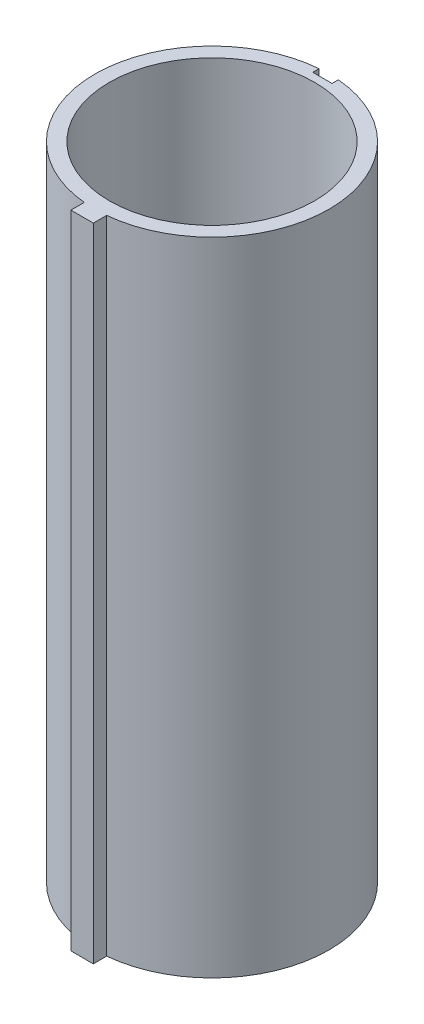
ISO-10303-21;
HEADER;
FILE_DESCRIPTION(('STEP AP214'),'2;1');
FILE_NAME('part.step','',(''),(''),'','','');
FILE_SCHEMA(('AUTOMOTIVE_DESIGN { 1 0 10303 214 1 1 1 1 }'));
ENDSEC;
DATA;
#1=APPLICATION_CONTEXT('core data for automotive mechanical design processes');
#2=APPLICATION_PROTOCOL_DEFINITION('international standard','automotive_design',2000,#1);
#3=PRODUCT_CONTEXT('',#1,'mechanical');
#4=PRODUCT('Part','Part','',(#3));
#5=PRODUCT_RELATED_PRODUCT_CATEGORY('part','',(#4));
#6=PRODUCT_DEFINITION_FORMATION('','',#4);
#7=PRODUCT_DEFINITION_CONTEXT('part definition',#1,'design');
#8=PRODUCT_DEFINITION('design','',#6,#7);
#9=PRODUCT_DEFINITION_SHAPE('','',#8);
#10=(LENGTH_UNIT() NAMED_UNIT(*) SI_UNIT(.MILLI.,.METRE.));
#11=(NAMED_UNIT(*) PLANE_ANGLE_UNIT() SI_UNIT($,.RADIAN.));
#12=(NAMED_UNIT(*) SI_UNIT($,.STERADIAN.) SOLID_ANGLE_UNIT());
#13=UNCERTAINTY_MEASURE_WITH_UNIT(LENGTH_MEASURE(1.E-05),#10,'distance_accuracy_value','');
#14=(GEOMETRIC_REPRESENTATION_CONTEXT(3) GLOBAL_UNCERTAINTY_ASSIGNED_CONTEXT((#13)) GLOBAL_UNIT_ASSIGNED_CONTEXT((#10,
#11,#12)) REPRESENTATION_CONTEXT('',''));
#15=CARTESIAN_POINT('',(0.,0.,0.));
#16=DIRECTION('',(0.,0.,1.));
#17=DIRECTION('',(1.,0.,0.));
#18=AXIS2_PLACEMENT_3D('',#15,#16,#17);
#19=CARTESIAN_POINT('',(-1.5,-0.00999999999999612,-17.2052126621942));
#20=DIRECTION('',(1.,0.,0.));
#21=DIRECTION('',(0.,0.,-1.));
#22=AXIS2_PLACEMENT_3D('',#19,#20,#21);
#23=PLANE('',#22);
#24=DIRECTION('',(0.,1.,0.));
#25=VECTOR('',#24,1.);
#26=CARTESIAN_POINT('',(-1.5,-0.00999999999999612,-17.2052126621942));
#27=LINE('',#26,#25);
#28=CARTESIAN_POINT('',(-1.5,0.,-17.2052126621942));
#29=VERTEX_POINT('',#28);
#30=CARTESIAN_POINT('',(-1.5,100.,-17.2052126621942));
#31=VERTEX_POINT('',#30);
#32=EDGE_CURVE('E11',#29,#31,#27,.T.);
#33=ORIENTED_EDGE('',*,*,#32,.F.);
#34=DIRECTION('',(0.,0.,-1.));
#35=VECTOR('',#34,1.);
#36=CARTESIAN_POINT('',(-1.5,0.,0.));
#37=LINE('',#36,#35);
#38=CARTESIAN_POINT('',(-1.5,0.,-18.1882517026788));
#39=VERTEX_POINT('',#38);
#40=EDGE_CURVE('E117',#29,#39,#37,.T.);
#41=ORIENTED_EDGE('',*,*,#40,.T.);
#42=DIRECTION('',(0.,-1.,0.));
#43=VECTOR('',#42,1.);
#44=CARTESIAN_POINT('',(-1.5,100.,-18.1882517026788));
#45=LINE('',#44,#43);
#46=CARTESIAN_POINT('',(-1.5,100.,-18.1882517026788));
#47=VERTEX_POINT('',#46);
#48=EDGE_CURVE('E42',#39,#47,#45,.F.);
#49=ORIENTED_EDGE('',*,*,#48,.T.);
#50=DIRECTION('',(0.,0.,-1.));
#51=VECTOR('',#50,1.);
#52=CARTESIAN_POINT('',(-1.5,100.,0.));
#53=LINE('',#52,#51);
#54=EDGE_CURVE('E137',#31,#47,#53,.T.);
#55=ORIENTED_EDGE('',*,*,#54,.F.);
#56=EDGE_LOOP('',(#33,#41,#49,#55));
#57=FACE_BOUND('',#56,.T.);
#58=ADVANCED_FACE('F38',(#57),#23,.T.);
#59=CARTESIAN_POINT('',(1.5,-0.00999999999999612,-21.2052126621942));
#60=DIRECTION('',(-1.,0.,0.));
#61=DIRECTION('',(0.,0.,1.));
#62=AXIS2_PLACEMENT_3D('',#59,#60,#61);
#63=PLANE('',#62);
#64=DIRECTION('',(0.,-1.,0.));
#65=VECTOR('',#64,1.);
#66=CARTESIAN_POINT('',(1.5,100.,-18.1882517026788));
#67=LINE('',#66,#65);
#68=CARTESIAN_POINT('',(1.5,0.,-18.1882517026788));
#69=VERTEX_POINT('',#68);
#70=CARTESIAN_POINT('',(1.5,100.,-18.1882517026788));
#71=VERTEX_POINT('',#70);
#72=EDGE_CURVE('E134',#69,#71,#67,.F.);
#73=ORIENTED_EDGE('',*,*,#72,.F.);
#74=DIRECTION('',(0.,0.,1.));
#75=VECTOR('',#74,1.);
#76=CARTESIAN_POINT('',(1.5,0.,0.));
#77=LINE('',#76,#75);
#78=CARTESIAN_POINT('',(1.5,0.,-17.2052126621942));
#79=VERTEX_POINT('',#78);
#80=EDGE_CURVE('E150',#69,#79,#77,.T.);
#81=ORIENTED_EDGE('',*,*,#80,.T.);
#82=DIRECTION('',(0.,1.,0.));
#83=VECTOR('',#82,1.);
#84=CARTESIAN_POINT('',(1.5,-0.00999999999999612,-17.2052126621942));
#85=LINE('',#84,#83);
#86=CARTESIAN_POINT('',(1.5,100.,-17.2052126621942));
#87=VERTEX_POINT('',#86);
#88=EDGE_CURVE('E47',#79,#87,#85,.T.);
#89=ORIENTED_EDGE('',*,*,#88,.T.);
#90=DIRECTION('',(0.,0.,1.));
#91=VECTOR('',#90,1.);
#92=CARTESIAN_POINT('',(1.5,100.,0.));
#93=LINE('',#92,#91);
#94=EDGE_CURVE('E145',#71,#87,#93,.T.);
#95=ORIENTED_EDGE('',*,*,#94,.F.);
#96=EDGE_LOOP('',(#73,#81,#89,#95));
#97=FACE_BOUND('',#96,.T.);
#98=ADVANCED_FACE('F157',(#97),#63,.T.);
#99=CARTESIAN_POINT('',(1.5,-0.00999999999999612,-17.2052126621942));
#100=DIRECTION('',(0.,0.,-1.));
#101=DIRECTION('',(-1.,0.,0.));
#102=AXIS2_PLACEMENT_3D('',#99,#100,#101);
#103=PLANE('',#102);
#104=ORIENTED_EDGE('',*,*,#88,.F.);
#105=DIRECTION('',(-1.,0.,0.));
#106=VECTOR('',#105,1.);
#107=CARTESIAN_POINT('',(0.,0.,-17.2052126621942));
#108=LINE('',#107,#106);
#109=EDGE_CURVE('E129',#79,#29,#108,.T.);
#110=ORIENTED_EDGE('',*,*,#109,.T.);
#111=ORIENTED_EDGE('',*,*,#32,.T.);
#112=DIRECTION('',(-1.,0.,0.));
#113=VECTOR('',#112,1.);
#114=CARTESIAN_POINT('',(0.,100.,-17.2052126621942));
#115=LINE('',#114,#113);
#116=EDGE_CURVE('E142',#87,#31,#115,.T.);
#117=ORIENTED_EDGE('',*,*,#116,.F.);
#118=EDGE_LOOP('',(#104,#110,#111,#117));
#119=FACE_BOUND('',#118,.T.);
#120=ADVANCED_FACE('F154',(#119),#103,.T.);
#121=CARTESIAN_POINT('',(0.,100.,0.));
#122=DIRECTION('',(0.,1.,0.));
#123=DIRECTION('',(0.,0.,1.));
#124=AXIS2_PLACEMENT_3D('',#121,#122,#123);
#125=PLANE('',#124);
#126=CARTESIAN_POINT('',(0.,100.,0.));
#127=DIRECTION('',(0.,1.,0.));
#128=DIRECTION('',(0.,0.,1.));
#129=AXIS2_PLACEMENT_3D('',#126,#127,#128);
#130=CIRCLE('',#129,16.);
#131=CARTESIAN_POINT('',(0.,100.,16.));
#132=VERTEX_POINT('',#131);
#133=EDGE_CURVE('E162',#132,#132,#130,.T.);
#134=ORIENTED_EDGE('',*,*,#133,.F.);
#135=EDGE_LOOP('',(#134));
#136=FACE_BOUND('',#135,.T.);
#137=CARTESIAN_POINT('',(0.,100.,0.));
#138=DIRECTION('',(0.,1.,0.));
#139=DIRECTION('',(0.,0.,1.));
#140=AXIS2_PLACEMENT_3D('',#137,#138,#139);
#141=CIRCLE('',#140,18.25);
#142=CARTESIAN_POINT('',(1.75000000000001,100.,18.1659021245849));
#143=VERTEX_POINT('',#142);
#144=EDGE_CURVE('E124',#143,#71,#141,.T.);
#145=ORIENTED_EDGE('',*,*,#144,.T.);
#146=ORIENTED_EDGE('',*,*,#94,.T.);
#147=ORIENTED_EDGE('',*,*,#116,.T.);
#148=ORIENTED_EDGE('',*,*,#54,.T.);
#149=CARTESIAN_POINT('',(-1.74999999999999,100.,18.1659021245849));
#150=VERTEX_POINT('',#149);
#151=EDGE_CURVE('E131',#47,#150,#141,.T.);
#152=ORIENTED_EDGE('',*,*,#151,.T.);
#153=DIRECTION('',(0.,0.,-1.));
#154=VECTOR('',#153,1.);
#155=CARTESIAN_POINT('',(-1.74999999999999,100.,20.25));
#156=LINE('',#155,#154);
#157=CARTESIAN_POINT('',(-1.74999999999999,100.,20.25));
#158=VERTEX_POINT('',#157);
#159=EDGE_CURVE('E55',#158,#150,#156,.T.);
#160=ORIENTED_EDGE('',*,*,#159,.F.);
#161=DIRECTION('',(-1.,0.,0.));
#162=VECTOR('',#161,1.);
#163=CARTESIAN_POINT('',(-1.74999999999999,100.,20.25));
#164=LINE('',#163,#162);
#165=CARTESIAN_POINT('',(1.75000000000001,100.,20.25));
#166=VERTEX_POINT('',#165);
#167=EDGE_CURVE('E175',#166,#158,#164,.T.);
#168=ORIENTED_EDGE('',*,*,#167,.F.);
#169=DIRECTION('',(0.,0.,1.));
#170=VECTOR('',#169,1.);
#171=CARTESIAN_POINT('',(1.75000000000001,100.,20.25));
#172=LINE('',#171,#170);
#173=EDGE_CURVE('E64',#143,#166,#172,.T.);
#174=ORIENTED_EDGE('',*,*,#173,.F.);
#175=EDGE_LOOP('',(#145,#146,#147,#148,#152,#160,#168,#174));
#176=FACE_BOUND('',#175,.T.);
#177=ADVANCED_FACE('F139',(#136,#176),#125,.T.);
#178=CARTESIAN_POINT('',(0.,0.,0.));
#179=DIRECTION('',(0.,1.,0.));
#180=DIRECTION('',(0.,0.,1.));
#181=AXIS2_PLACEMENT_3D('',#178,#179,#180);
#182=PLANE('',#181);
#183=CARTESIAN_POINT('',(0.,0.,0.));
#184=DIRECTION('',(0.,1.,0.));
#185=DIRECTION('',(0.,0.,1.));
#186=AXIS2_PLACEMENT_3D('',#183,#184,#185);
#187=CIRCLE('',#186,16.);
#188=CARTESIAN_POINT('',(0.,0.,16.));
#189=VERTEX_POINT('',#188);
#190=EDGE_CURVE('E164',#189,#189,#187,.T.);
#191=ORIENTED_EDGE('',*,*,#190,.T.);
#192=EDGE_LOOP('',(#191));
#193=FACE_BOUND('',#192,.T.);
#194=ORIENTED_EDGE('',*,*,#80,.F.);
#195=CARTESIAN_POINT('',(0.,0.,0.));
#196=DIRECTION('',(0.,1.,0.));
#197=DIRECTION('',(0.,0.,1.));
#198=AXIS2_PLACEMENT_3D('',#195,#196,#197);
#199=CIRCLE('',#198,18.25);
#200=CARTESIAN_POINT('',(1.75000000000001,0.,18.1659021245849));
#201=VERTEX_POINT('',#200);
#202=EDGE_CURVE('E123',#201,#69,#199,.T.);
#203=ORIENTED_EDGE('',*,*,#202,.F.);
#204=DIRECTION('',(0.,0.,1.));
#205=VECTOR('',#204,1.);
#206=CARTESIAN_POINT('',(1.75000000000001,0.,20.25));
#207=LINE('',#206,#205);
#208=CARTESIAN_POINT('',(1.75000000000001,0.,20.25));
#209=VERTEX_POINT('',#208);
#210=EDGE_CURVE('E76',#201,#209,#207,.T.);
#211=ORIENTED_EDGE('',*,*,#210,.T.);
#212=DIRECTION('',(-1.,0.,0.));
#213=VECTOR('',#212,1.);
#214=CARTESIAN_POINT('',(-1.74999999999999,0.,20.25));
#215=LINE('',#214,#213);
#216=CARTESIAN_POINT('',(-1.74999999999999,0.,20.25));
#217=VERTEX_POINT('',#216);
#218=EDGE_CURVE('E181',#209,#217,#215,.T.);
#219=ORIENTED_EDGE('',*,*,#218,.T.);
#220=DIRECTION('',(0.,0.,-1.));
#221=VECTOR('',#220,1.);
#222=CARTESIAN_POINT('',(-1.74999999999999,0.,20.25));
#223=LINE('',#222,#221);
#224=CARTESIAN_POINT('',(-1.74999999999999,0.,18.1659021245849));
#225=VERTEX_POINT('',#224);
#226=EDGE_CURVE('E120',#217,#225,#223,.T.);
#227=ORIENTED_EDGE('',*,*,#226,.T.);
#228=EDGE_CURVE('E113',#39,#225,#199,.T.);
#229=ORIENTED_EDGE('',*,*,#228,.F.);
#230=ORIENTED_EDGE('',*,*,#40,.F.);
#231=ORIENTED_EDGE('',*,*,#109,.F.);
#232=EDGE_LOOP('',(#194,#203,#211,#219,#227,#229,#230,#231));
#233=FACE_BOUND('',#232,.T.);
#234=ADVANCED_FACE('F40',(#193,#233),#182,.F.);
#235=CARTESIAN_POINT('',(0.,100.,0.));
#236=DIRECTION('',(0.,-1.,0.));
#237=DIRECTION('',(0.,0.,-1.));
#238=AXIS2_PLACEMENT_3D('',#235,#236,#237);
#239=CYLINDRICAL_SURFACE('',#238,18.25);
#240=ORIENTED_EDGE('',*,*,#228,.T.);
#241=DIRECTION('',(0.,-1.,0.));
#242=VECTOR('',#241,1.);
#243=CARTESIAN_POINT('',(-1.74999999999999,100.,18.1659021245849));
#244=LINE('',#243,#242);
#245=EDGE_CURVE('E133',#225,#150,#244,.F.);
#246=ORIENTED_EDGE('',*,*,#245,.T.);
#247=ORIENTED_EDGE('',*,*,#151,.F.);
#248=ORIENTED_EDGE('',*,*,#48,.F.);
#249=EDGE_LOOP('',(#240,#246,#247,#248));
#250=FACE_BOUND('',#249,.T.);
#251=ADVANCED_FACE('F130',(#250),#239,.T.);
#252=ORIENTED_EDGE('',*,*,#144,.F.);
#253=DIRECTION('',(0.,-1.,0.));
#254=VECTOR('',#253,1.);
#255=CARTESIAN_POINT('',(1.75000000000001,100.,18.1659021245849));
#256=LINE('',#255,#254);
#257=EDGE_CURVE('E79',#143,#201,#256,.T.);
#258=ORIENTED_EDGE('',*,*,#257,.T.);
#259=ORIENTED_EDGE('',*,*,#202,.T.);
#260=ORIENTED_EDGE('',*,*,#72,.T.);
#261=EDGE_LOOP('',(#252,#258,#259,#260));
#262=FACE_BOUND('',#261,.T.);
#263=ADVANCED_FACE('F161',(#262),#239,.T.);
#264=CARTESIAN_POINT('',(0.,100.,0.));
#265=DIRECTION('',(0.,-1.,0.));
#266=DIRECTION('',(0.,0.,-1.));
#267=AXIS2_PLACEMENT_3D('',#264,#265,#266);
#268=CYLINDRICAL_SURFACE('',#267,16.);
#269=ORIENTED_EDGE('',*,*,#133,.T.);
#270=EDGE_LOOP('',(#269));
#271=FACE_BOUND('',#270,.T.);
#272=ORIENTED_EDGE('',*,*,#190,.F.);
#273=EDGE_LOOP('',(#272));
#274=FACE_BOUND('',#273,.T.);
#275=ADVANCED_FACE('F190',(#271,#274),#268,.F.);
#276=CARTESIAN_POINT('',(-1.74999999999999,105.315072906367,20.25));
#277=DIRECTION('',(-1.,0.,0.));
#278=DIRECTION('',(0.,0.,1.));
#279=AXIS2_PLACEMENT_3D('',#276,#277,#278);
#280=PLANE('',#279);
#281=ORIENTED_EDGE('',*,*,#245,.F.);
#282=ORIENTED_EDGE('',*,*,#226,.F.);
#283=DIRECTION('',(0.,-1.,0.));
#284=VECTOR('',#283,1.);
#285=CARTESIAN_POINT('',(-1.74999999999999,105.315072906367,20.25));
#286=LINE('',#285,#284);
#287=EDGE_CURVE('E173',#158,#217,#286,.T.);
#288=ORIENTED_EDGE('',*,*,#287,.F.);
#289=ORIENTED_EDGE('',*,*,#159,.T.);
#290=EDGE_LOOP('',(#281,#282,#288,#289));
#291=FACE_BOUND('',#290,.T.);
#292=ADVANCED_FACE('F187',(#291),#280,.T.);
#293=CARTESIAN_POINT('',(1.75000000000001,105.315072906367,20.25));
#294=DIRECTION('',(1.,0.,0.));
#295=DIRECTION('',(0.,0.,-1.));
#296=AXIS2_PLACEMENT_3D('',#293,#294,#295);
#297=PLANE('',#296);
#298=ORIENTED_EDGE('',*,*,#257,.F.);
#299=ORIENTED_EDGE('',*,*,#173,.T.);
#300=DIRECTION('',(0.,-1.,0.));
#301=VECTOR('',#300,1.);
#302=CARTESIAN_POINT('',(1.75000000000001,105.315072906367,20.25));
#303=LINE('',#302,#301);
#304=EDGE_CURVE('E171',#166,#209,#303,.T.);
#305=ORIENTED_EDGE('',*,*,#304,.T.);
#306=ORIENTED_EDGE('',*,*,#210,.F.);
#307=EDGE_LOOP('',(#298,#299,#305,#306));
#308=FACE_BOUND('',#307,.T.);
#309=ADVANCED_FACE('F189',(#308),#297,.T.);
#310=CARTESIAN_POINT('',(-1.74999999999999,105.315072906367,20.25));
#311=DIRECTION('',(0.,0.,1.));
#312=DIRECTION('',(1.,0.,0.));
#313=AXIS2_PLACEMENT_3D('',#310,#311,#312);
#314=PLANE('',#313);
#315=ORIENTED_EDGE('',*,*,#304,.F.);
#316=ORIENTED_EDGE('',*,*,#167,.T.);
#317=ORIENTED_EDGE('',*,*,#287,.T.);
#318=ORIENTED_EDGE('',*,*,#218,.F.);
#319=EDGE_LOOP('',(#315,#316,#317,#318));
#320=FACE_BOUND('',#319,.T.);
#321=ADVANCED_FACE('F186',(#320),#314,.T.);
#322=CLOSED_SHELL('',(#58,#98,#120,#177,#234,#251,#263,#275,#292,#309,#321));
#323=MANIFOLD_SOLID_BREP('B2',#322);
#324=ADVANCED_BREP_SHAPE_REPRESENTATION('',(#18,#323),#14);
#325=SHAPE_DEFINITION_REPRESENTATION(#9,#324);
ENDSEC;
END-ISO-10303-21;
